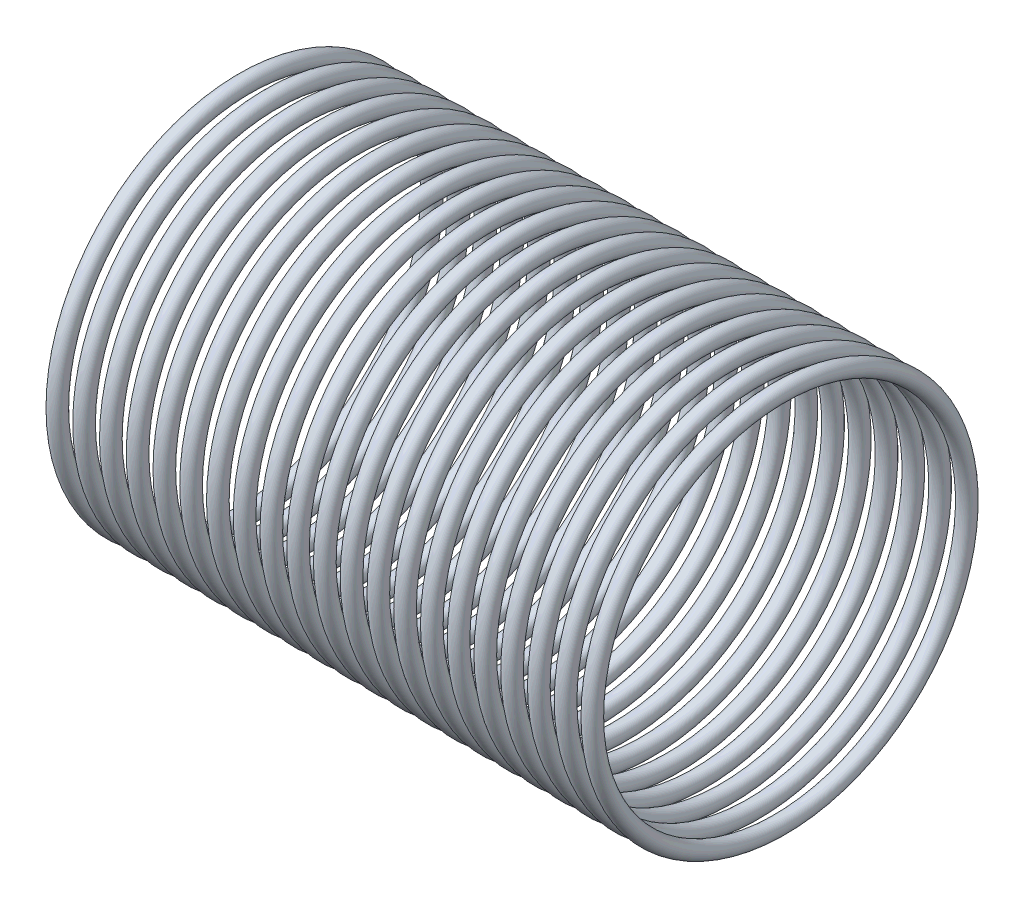
ISO-10303-21;
HEADER;
FILE_DESCRIPTION(('STEP AP214'),'2;1');
FILE_NAME('part.step','',(''),(''),'','','');
FILE_SCHEMA(('AUTOMOTIVE_DESIGN { 1 0 10303 214 1 1 1 1 }'));
ENDSEC;
DATA;
#1=APPLICATION_CONTEXT('core data for automotive mechanical design processes');
#2=APPLICATION_PROTOCOL_DEFINITION('international standard','automotive_design',2000,#1);
#3=PRODUCT_CONTEXT('',#1,'mechanical');
#4=PRODUCT('Part','Part','',(#3));
#5=PRODUCT_RELATED_PRODUCT_CATEGORY('part','',(#4));
#6=PRODUCT_DEFINITION_FORMATION('','',#4);
#7=PRODUCT_DEFINITION_CONTEXT('part definition',#1,'design');
#8=PRODUCT_DEFINITION('design','',#6,#7);
#9=PRODUCT_DEFINITION_SHAPE('','',#8);
#10=(LENGTH_UNIT() NAMED_UNIT(*) SI_UNIT(.MILLI.,.METRE.));
#11=(NAMED_UNIT(*) PLANE_ANGLE_UNIT() SI_UNIT($,.RADIAN.));
#12=(NAMED_UNIT(*) SI_UNIT($,.STERADIAN.) SOLID_ANGLE_UNIT());
#13=UNCERTAINTY_MEASURE_WITH_UNIT(LENGTH_MEASURE(1.E-05),#10,'distance_accuracy_value','');
#14=(GEOMETRIC_REPRESENTATION_CONTEXT(3) GLOBAL_UNCERTAINTY_ASSIGNED_CONTEXT((#13)) GLOBAL_UNIT_ASSIGNED_CONTEXT((#10,
#11,#12)) REPRESENTATION_CONTEXT('',''));
#15=CARTESIAN_POINT('',(0.,0.,0.));
#16=DIRECTION('',(0.,0.,1.));
#17=DIRECTION('',(1.,0.,0.));
#18=AXIS2_PLACEMENT_3D('',#15,#16,#17);
#19=CARTESIAN_POINT('',(10.,0.,0.));
#20=DIRECTION('',(-1.,0.,0.));
#21=DIRECTION('',(0.,0.,1.));
#22=AXIS2_PLACEMENT_3D('',#19,#20,#21);
#23=TOROIDAL_SURFACE('',#22,7.,0.3);
#24=ADVANCED_FACE('P0_F14',(),#23,.T.);
#25=CLOSED_SHELL('',(#24));
#26=MANIFOLD_SOLID_BREP('P0_B1',#25);
#27=CARTESIAN_POINT('',(3.,0.,0.));
#28=DIRECTION('',(-1.,0.,0.));
#29=DIRECTION('',(0.,0.,1.));
#30=AXIS2_PLACEMENT_3D('',#27,#28,#29);
#31=TOROIDAL_SURFACE('',#30,7.,0.3);
#32=ADVANCED_FACE('P1_F14',(),#31,.T.);
#33=CLOSED_SHELL('',(#32));
#34=MANIFOLD_SOLID_BREP('P1_B1',#33);
#35=CARTESIAN_POINT('',(5.,0.,0.));
#36=DIRECTION('',(-1.,0.,0.));
#37=DIRECTION('',(0.,0.,1.));
#38=AXIS2_PLACEMENT_3D('',#35,#36,#37);
#39=TOROIDAL_SURFACE('',#38,7.,0.3);
#40=ADVANCED_FACE('P2_F14',(),#39,.T.);
#41=CLOSED_SHELL('',(#40));
#42=MANIFOLD_SOLID_BREP('P2_B1',#41);
#43=CARTESIAN_POINT('',(14.,0.,0.));
#44=DIRECTION('',(-1.,0.,0.));
#45=DIRECTION('',(0.,0.,1.));
#46=AXIS2_PLACEMENT_3D('',#43,#44,#45);
#47=TOROIDAL_SURFACE('',#46,7.,0.3);
#48=ADVANCED_FACE('P3_F14',(),#47,.T.);
#49=CLOSED_SHELL('',(#48));
#50=MANIFOLD_SOLID_BREP('P3_B1',#49);
#51=CARTESIAN_POINT('',(6.,0.,0.));
#52=DIRECTION('',(-1.,0.,0.));
#53=DIRECTION('',(0.,0.,1.));
#54=AXIS2_PLACEMENT_3D('',#51,#52,#53);
#55=TOROIDAL_SURFACE('',#54,7.,0.3);
#56=ADVANCED_FACE('P4_F13',(),#55,.T.);
#57=CLOSED_SHELL('',(#56));
#58=MANIFOLD_SOLID_BREP('P4_B1',#57);
#59=CARTESIAN_POINT('',(4.,0.,0.));
#60=DIRECTION('',(-1.,0.,0.));
#61=DIRECTION('',(0.,0.,1.));
#62=AXIS2_PLACEMENT_3D('',#59,#60,#61);
#63=TOROIDAL_SURFACE('',#62,7.,0.3);
#64=ADVANCED_FACE('P5_F14',(),#63,.T.);
#65=CLOSED_SHELL('',(#64));
#66=MANIFOLD_SOLID_BREP('P5_B1',#65);
#67=CARTESIAN_POINT('',(12.,0.,0.));
#68=DIRECTION('',(-1.,0.,0.));
#69=DIRECTION('',(0.,0.,1.));
#70=AXIS2_PLACEMENT_3D('',#67,#68,#69);
#71=TOROIDAL_SURFACE('',#70,7.,0.3);
#72=ADVANCED_FACE('P6_F14',(),#71,.T.);
#73=CLOSED_SHELL('',(#72));
#74=MANIFOLD_SOLID_BREP('P6_B1',#73);
#75=CARTESIAN_POINT('',(9.,0.,0.));
#76=DIRECTION('',(-1.,0.,0.));
#77=DIRECTION('',(0.,0.,1.));
#78=AXIS2_PLACEMENT_3D('',#75,#76,#77);
#79=TOROIDAL_SURFACE('',#78,7.,0.3);
#80=ADVANCED_FACE('P7_F14',(),#79,.T.);
#81=CLOSED_SHELL('',(#80));
#82=MANIFOLD_SOLID_BREP('P7_B1',#81);
#83=CARTESIAN_POINT('',(7.,0.,0.));
#84=DIRECTION('',(-1.,0.,0.));
#85=DIRECTION('',(0.,0.,1.));
#86=AXIS2_PLACEMENT_3D('',#83,#84,#85);
#87=TOROIDAL_SURFACE('',#86,7.,0.3);
#88=ADVANCED_FACE('P8_F14',(),#87,.T.);
#89=CLOSED_SHELL('',(#88));
#90=MANIFOLD_SOLID_BREP('P8_B1',#89);
#91=CARTESIAN_POINT('',(15.,0.,0.));
#92=DIRECTION('',(-1.,0.,0.));
#93=DIRECTION('',(0.,0.,1.));
#94=AXIS2_PLACEMENT_3D('',#91,#92,#93);
#95=TOROIDAL_SURFACE('',#94,7.,0.3);
#96=ADVANCED_FACE('P9_F14',(),#95,.T.);
#97=CLOSED_SHELL('',(#96));
#98=MANIFOLD_SOLID_BREP('P9_B1',#97);
#99=CARTESIAN_POINT('',(2.,0.,0.));
#100=DIRECTION('',(-1.,0.,0.));
#101=DIRECTION('',(0.,0.,1.));
#102=AXIS2_PLACEMENT_3D('',#99,#100,#101);
#103=TOROIDAL_SURFACE('',#102,7.,0.3);
#104=ADVANCED_FACE('P10_F14',(),#103,.T.);
#105=CLOSED_SHELL('',(#104));
#106=MANIFOLD_SOLID_BREP('P10_B1',#105);
#107=CARTESIAN_POINT('',(13.,0.,0.));
#108=DIRECTION('',(-1.,0.,0.));
#109=DIRECTION('',(0.,0.,1.));
#110=AXIS2_PLACEMENT_3D('',#107,#108,#109);
#111=TOROIDAL_SURFACE('',#110,7.,0.3);
#112=ADVANCED_FACE('P11_F14',(),#111,.T.);
#113=CLOSED_SHELL('',(#112));
#114=MANIFOLD_SOLID_BREP('P11_B1',#113);
#115=CARTESIAN_POINT('',(1.,0.,0.));
#116=DIRECTION('',(-1.,0.,0.));
#117=DIRECTION('',(0.,0.,1.));
#118=AXIS2_PLACEMENT_3D('',#115,#116,#117);
#119=TOROIDAL_SURFACE('',#118,7.,0.3);
#120=ADVANCED_FACE('P12_F14',(),#119,.T.);
#121=CLOSED_SHELL('',(#120));
#122=MANIFOLD_SOLID_BREP('P12_B1',#121);
#123=CARTESIAN_POINT('',(17.,0.,0.));
#124=DIRECTION('',(-1.,0.,0.));
#125=DIRECTION('',(0.,0.,1.));
#126=AXIS2_PLACEMENT_3D('',#123,#124,#125);
#127=TOROIDAL_SURFACE('',#126,7.,0.3);
#128=ADVANCED_FACE('P13_F14',(),#127,.T.);
#129=CLOSED_SHELL('',(#128));
#130=MANIFOLD_SOLID_BREP('P13_B1',#129);
#131=CARTESIAN_POINT('',(0.,0.,0.));
#132=DIRECTION('',(-1.,0.,0.));
#133=DIRECTION('',(0.,0.,1.));
#134=AXIS2_PLACEMENT_3D('',#131,#132,#133);
#135=TOROIDAL_SURFACE('',#134,7.,0.3);
#136=ADVANCED_FACE('P14_F14',(),#135,.T.);
#137=CLOSED_SHELL('',(#136));
#138=MANIFOLD_SOLID_BREP('P14_B1',#137);
#139=CARTESIAN_POINT('',(20.,0.,0.));
#140=DIRECTION('',(-1.,0.,0.));
#141=DIRECTION('',(0.,0.,1.));
#142=AXIS2_PLACEMENT_3D('',#139,#140,#141);
#143=TOROIDAL_SURFACE('',#142,7.,0.3);
#144=ADVANCED_FACE('P15_F14',(),#143,.T.);
#145=CLOSED_SHELL('',(#144));
#146=MANIFOLD_SOLID_BREP('P15_B1',#145);
#147=CARTESIAN_POINT('',(8.,0.,0.));
#148=DIRECTION('',(-1.,0.,0.));
#149=DIRECTION('',(0.,0.,1.));
#150=AXIS2_PLACEMENT_3D('',#147,#148,#149);
#151=TOROIDAL_SURFACE('',#150,7.,0.3);
#152=ADVANCED_FACE('P16_F14',(),#151,.T.);
#153=CLOSED_SHELL('',(#152));
#154=MANIFOLD_SOLID_BREP('P16_B1',#153);
#155=CARTESIAN_POINT('',(18.,0.,0.));
#156=DIRECTION('',(-1.,0.,0.));
#157=DIRECTION('',(0.,0.,1.));
#158=AXIS2_PLACEMENT_3D('',#155,#156,#157);
#159=TOROIDAL_SURFACE('',#158,7.,0.3);
#160=ADVANCED_FACE('P17_F14',(),#159,.T.);
#161=CLOSED_SHELL('',(#160));
#162=MANIFOLD_SOLID_BREP('P17_B1',#161);
#163=CARTESIAN_POINT('',(19.,0.,0.));
#164=DIRECTION('',(-1.,0.,0.));
#165=DIRECTION('',(0.,0.,1.));
#166=AXIS2_PLACEMENT_3D('',#163,#164,#165);
#167=TOROIDAL_SURFACE('',#166,7.,0.3);
#168=ADVANCED_FACE('P18_F14',(),#167,.T.);
#169=CLOSED_SHELL('',(#168));
#170=MANIFOLD_SOLID_BREP('P18_B1',#169);
#171=CARTESIAN_POINT('',(11.,0.,0.));
#172=DIRECTION('',(-1.,0.,0.));
#173=DIRECTION('',(0.,0.,1.));
#174=AXIS2_PLACEMENT_3D('',#171,#172,#173);
#175=TOROIDAL_SURFACE('',#174,7.,0.3);
#176=ADVANCED_FACE('P19_F14',(),#175,.T.);
#177=CLOSED_SHELL('',(#176));
#178=MANIFOLD_SOLID_BREP('P19_B1',#177);
#179=CARTESIAN_POINT('',(16.,0.,0.));
#180=DIRECTION('',(-1.,0.,0.));
#181=DIRECTION('',(0.,0.,1.));
#182=AXIS2_PLACEMENT_3D('',#179,#180,#181);
#183=TOROIDAL_SURFACE('',#182,7.,0.3);
#184=ADVANCED_FACE('P20_F14',(),#183,.T.);
#185=CLOSED_SHELL('',(#184));
#186=MANIFOLD_SOLID_BREP('P20_B1',#185);
#187=ADVANCED_BREP_SHAPE_REPRESENTATION('',(#18,#26,#34,#42,#50,#58,#66,#74,#82,#90,#98,#106,
#114,#122,#130,#138,#146,#154,#162,#170,#178,#186),#14);
#188=SHAPE_DEFINITION_REPRESENTATION(#9,#187);
ENDSEC;
END-ISO-10303-21;
